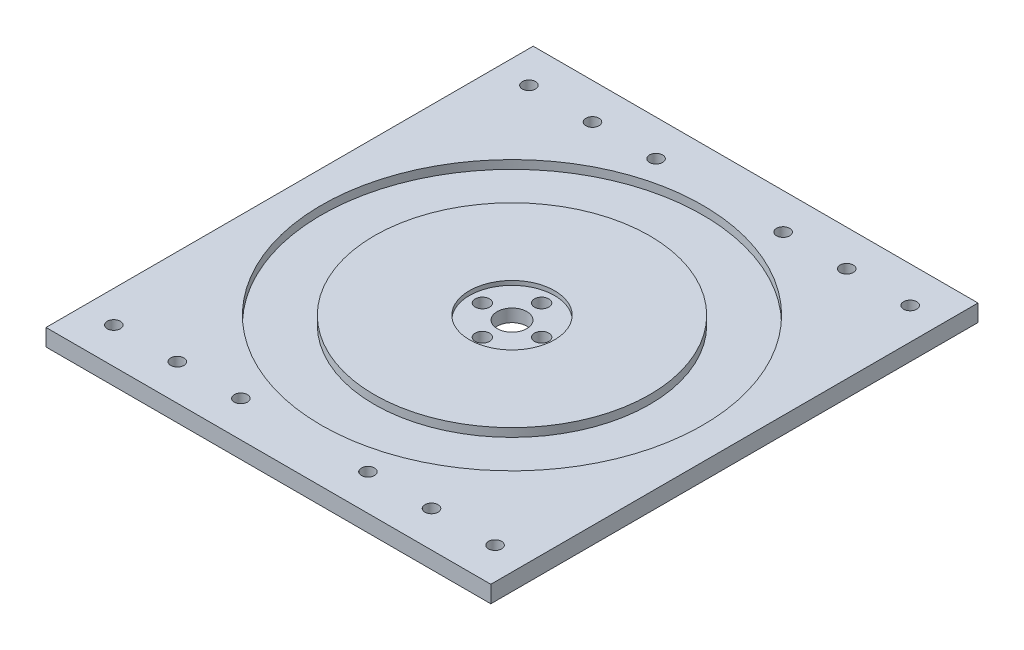
ISO-10303-21;
HEADER;
FILE_DESCRIPTION(('STEP AP214'),'2;1');
FILE_NAME('part.step','',(''),(''),'','','');
FILE_SCHEMA(('AUTOMOTIVE_DESIGN { 1 0 10303 214 1 1 1 1 }'));
ENDSEC;
DATA;
#1=APPLICATION_CONTEXT('core data for automotive mechanical design processes');
#2=APPLICATION_PROTOCOL_DEFINITION('international standard','automotive_design',2000,#1);
#3=PRODUCT_CONTEXT('',#1,'mechanical');
#4=PRODUCT('Part','Part','',(#3));
#5=PRODUCT_RELATED_PRODUCT_CATEGORY('part','',(#4));
#6=PRODUCT_DEFINITION_FORMATION('','',#4);
#7=PRODUCT_DEFINITION_CONTEXT('part definition',#1,'design');
#8=PRODUCT_DEFINITION('design','',#6,#7);
#9=PRODUCT_DEFINITION_SHAPE('','',#8);
#10=(LENGTH_UNIT() NAMED_UNIT(*) SI_UNIT(.MILLI.,.METRE.));
#11=(NAMED_UNIT(*) PLANE_ANGLE_UNIT() SI_UNIT($,.RADIAN.));
#12=(NAMED_UNIT(*) SI_UNIT($,.STERADIAN.) SOLID_ANGLE_UNIT());
#13=UNCERTAINTY_MEASURE_WITH_UNIT(LENGTH_MEASURE(1.E-05),#10,'distance_accuracy_value','');
#14=(GEOMETRIC_REPRESENTATION_CONTEXT(3) GLOBAL_UNCERTAINTY_ASSIGNED_CONTEXT((#13)) GLOBAL_UNIT_ASSIGNED_CONTEXT((#10,
#11,#12)) REPRESENTATION_CONTEXT('',''));
#15=CARTESIAN_POINT('',(0.,0.,0.));
#16=DIRECTION('',(0.,0.,1.));
#17=DIRECTION('',(1.,0.,0.));
#18=AXIS2_PLACEMENT_3D('',#15,#16,#17);
#19=CARTESIAN_POINT('',(0.,4.,0.));
#20=DIRECTION('',(0.,-1.,0.));
#21=DIRECTION('',(0.,0.,-1.));
#22=AXIS2_PLACEMENT_3D('',#19,#20,#21);
#23=CYLINDRICAL_SURFACE('',#22,3.5);
#24=CARTESIAN_POINT('',(0.,0.,0.));
#25=DIRECTION('',(0.,1.,0.));
#26=DIRECTION('',(0.,0.,1.));
#27=AXIS2_PLACEMENT_3D('',#24,#25,#26);
#28=CIRCLE('',#27,3.5);
#29=CARTESIAN_POINT('',(0.,0.,3.5));
#30=VERTEX_POINT('',#29);
#31=EDGE_CURVE('E109',#30,#30,#28,.T.);
#32=ORIENTED_EDGE('',*,*,#31,.F.);
#33=EDGE_LOOP('',(#32));
#34=FACE_BOUND('',#33,.T.);
#35=CARTESIAN_POINT('',(0.,3.,0.));
#36=DIRECTION('',(0.,1.,0.));
#37=DIRECTION('',(0.,0.,1.));
#38=AXIS2_PLACEMENT_3D('',#35,#36,#37);
#39=CIRCLE('',#38,3.5);
#40=CARTESIAN_POINT('',(0.,3.,3.5));
#41=VERTEX_POINT('',#40);
#42=EDGE_CURVE('E43',#41,#41,#39,.T.);
#43=ORIENTED_EDGE('',*,*,#42,.T.);
#44=EDGE_LOOP('',(#43));
#45=FACE_BOUND('',#44,.T.);
#46=ADVANCED_FACE('F39',(#34,#45),#23,.F.);
#47=CARTESIAN_POINT('',(0.,4.,0.));
#48=DIRECTION('',(0.,-1.,0.));
#49=DIRECTION('',(0.,0.,-1.));
#50=AXIS2_PLACEMENT_3D('',#47,#48,#49);
#51=PLANE('',#50);
#52=CARTESIAN_POINT('',(0.,4.,0.));
#53=DIRECTION('',(0.,1.,0.));
#54=DIRECTION('',(0.,0.,1.));
#55=AXIS2_PLACEMENT_3D('',#52,#53,#54);
#56=CIRCLE('',#55,10.05);
#57=CARTESIAN_POINT('',(0.,4.,10.05));
#58=VERTEX_POINT('',#57);
#59=EDGE_CURVE('E207',#58,#58,#56,.T.);
#60=ORIENTED_EDGE('',*,*,#59,.F.);
#61=EDGE_LOOP('',(#60));
#62=FACE_BOUND('',#61,.T.);
#63=CARTESIAN_POINT('',(0.,4.,0.));
#64=DIRECTION('',(0.,1.,0.));
#65=DIRECTION('',(0.,0.,1.));
#66=AXIS2_PLACEMENT_3D('',#63,#64,#65);
#67=CIRCLE('',#66,32.5);
#68=CARTESIAN_POINT('',(0.,4.,32.5));
#69=VERTEX_POINT('',#68);
#70=EDGE_CURVE('E202',#69,#69,#67,.T.);
#71=ORIENTED_EDGE('',*,*,#70,.T.);
#72=EDGE_LOOP('',(#71));
#73=FACE_BOUND('',#72,.T.);
#74=ADVANCED_FACE('F258',(#62,#73),#51,.F.);
#75=CARTESIAN_POINT('',(0.,4.,0.));
#76=DIRECTION('',(0.,1.,0.));
#77=DIRECTION('',(0.,0.,1.));
#78=AXIS2_PLACEMENT_3D('',#75,#76,#77);
#79=CIRCLE('',#78,45.);
#80=CARTESIAN_POINT('',(0.,4.,45.));
#81=VERTEX_POINT('',#80);
#82=EDGE_CURVE('E196',#81,#81,#79,.T.);
#83=ORIENTED_EDGE('',*,*,#82,.F.);
#84=EDGE_LOOP('',(#83));
#85=FACE_BOUND('',#84,.T.);
#86=DIRECTION('',(0.,0.,-1.));
#87=VECTOR('',#86,1.);
#88=CARTESIAN_POINT('',(52.5,4.,57.5));
#89=LINE('',#88,#87);
#90=CARTESIAN_POINT('',(52.5,4.,57.5));
#91=VERTEX_POINT('',#90);
#92=CARTESIAN_POINT('',(52.5,4.,-57.5));
#93=VERTEX_POINT('',#92);
#94=EDGE_CURVE('E93',#91,#93,#89,.T.);
#95=ORIENTED_EDGE('',*,*,#94,.T.);
#96=DIRECTION('',(-1.,0.,0.));
#97=VECTOR('',#96,1.);
#98=CARTESIAN_POINT('',(-52.5,4.,-57.5));
#99=LINE('',#98,#97);
#100=CARTESIAN_POINT('',(-52.5,4.,-57.5));
#101=VERTEX_POINT('',#100);
#102=EDGE_CURVE('E87',#93,#101,#99,.T.);
#103=ORIENTED_EDGE('',*,*,#102,.T.);
#104=DIRECTION('',(0.,0.,1.));
#105=VECTOR('',#104,1.);
#106=CARTESIAN_POINT('',(-52.5,4.,57.5));
#107=LINE('',#106,#105);
#108=CARTESIAN_POINT('',(-52.5,4.,57.5));
#109=VERTEX_POINT('',#108);
#110=EDGE_CURVE('E91',#101,#109,#107,.T.);
#111=ORIENTED_EDGE('',*,*,#110,.T.);
#112=DIRECTION('',(1.,0.,0.));
#113=VECTOR('',#112,1.);
#114=CARTESIAN_POINT('',(-52.5,4.,57.5));
#115=LINE('',#114,#113);
#116=EDGE_CURVE('E57',#109,#91,#115,.T.);
#117=ORIENTED_EDGE('',*,*,#116,.T.);
#118=EDGE_LOOP('',(#95,#103,#111,#117));
#119=FACE_BOUND('',#118,.T.);
#120=CARTESIAN_POINT('',(45.,4.,-49.));
#121=DIRECTION('',(0.,1.,0.));
#122=DIRECTION('',(0.,0.,1.));
#123=AXIS2_PLACEMENT_3D('',#120,#121,#122);
#124=CIRCLE('',#123,1.55);
#125=CARTESIAN_POINT('',(45.,4.,-47.45));
#126=VERTEX_POINT('',#125);
#127=EDGE_CURVE('E123',#126,#126,#124,.T.);
#128=ORIENTED_EDGE('',*,*,#127,.F.);
#129=EDGE_LOOP('',(#128));
#130=FACE_BOUND('',#129,.T.);
#131=CARTESIAN_POINT('',(45.,4.,49.));
#132=DIRECTION('',(0.,1.,0.));
#133=DIRECTION('',(0.,0.,-1.));
#134=AXIS2_PLACEMENT_3D('',#131,#132,#133);
#135=CIRCLE('',#134,1.55);
#136=CARTESIAN_POINT('',(45.,4.,47.45));
#137=VERTEX_POINT('',#136);
#138=EDGE_CURVE('E127',#137,#137,#135,.T.);
#139=ORIENTED_EDGE('',*,*,#138,.F.);
#140=EDGE_LOOP('',(#139));
#141=FACE_BOUND('',#140,.T.);
#142=CARTESIAN_POINT('',(-45.,4.,49.));
#143=DIRECTION('',(0.,1.,0.));
#144=DIRECTION('',(0.,0.,1.));
#145=AXIS2_PLACEMENT_3D('',#142,#143,#144);
#146=CIRCLE('',#145,1.55);
#147=CARTESIAN_POINT('',(-45.,4.,50.55));
#148=VERTEX_POINT('',#147);
#149=EDGE_CURVE('E133',#148,#148,#146,.T.);
#150=ORIENTED_EDGE('',*,*,#149,.F.);
#151=EDGE_LOOP('',(#150));
#152=FACE_BOUND('',#151,.T.);
#153=CARTESIAN_POINT('',(-45.,4.,-49.));
#154=DIRECTION('',(0.,1.,0.));
#155=DIRECTION('',(0.,0.,-1.));
#156=AXIS2_PLACEMENT_3D('',#153,#154,#155);
#157=CIRCLE('',#156,1.55);
#158=CARTESIAN_POINT('',(-45.,4.,-50.55));
#159=VERTEX_POINT('',#158);
#160=EDGE_CURVE('E139',#159,#159,#157,.T.);
#161=ORIENTED_EDGE('',*,*,#160,.F.);
#162=EDGE_LOOP('',(#161));
#163=FACE_BOUND('',#162,.T.);
#164=CARTESIAN_POINT('',(-15.,4.,49.));
#165=DIRECTION('',(0.,1.,0.));
#166=DIRECTION('',(0.,0.,1.));
#167=AXIS2_PLACEMENT_3D('',#164,#165,#166);
#168=CIRCLE('',#167,1.55);
#169=CARTESIAN_POINT('',(-15.,4.,50.55));
#170=VERTEX_POINT('',#169);
#171=EDGE_CURVE('E145',#170,#170,#168,.T.);
#172=ORIENTED_EDGE('',*,*,#171,.F.);
#173=EDGE_LOOP('',(#172));
#174=FACE_BOUND('',#173,.T.);
#175=CARTESIAN_POINT('',(15.,4.,49.));
#176=DIRECTION('',(0.,1.,0.));
#177=DIRECTION('',(0.,0.,-1.));
#178=AXIS2_PLACEMENT_3D('',#175,#176,#177);
#179=CIRCLE('',#178,1.55);
#180=CARTESIAN_POINT('',(15.,4.,47.45));
#181=VERTEX_POINT('',#180);
#182=EDGE_CURVE('E151',#181,#181,#179,.T.);
#183=ORIENTED_EDGE('',*,*,#182,.F.);
#184=EDGE_LOOP('',(#183));
#185=FACE_BOUND('',#184,.T.);
#186=CARTESIAN_POINT('',(15.,4.,-49.));
#187=DIRECTION('',(0.,1.,0.));
#188=DIRECTION('',(0.,0.,1.));
#189=AXIS2_PLACEMENT_3D('',#186,#187,#188);
#190=CIRCLE('',#189,1.55);
#191=CARTESIAN_POINT('',(15.,4.,-47.45));
#192=VERTEX_POINT('',#191);
#193=EDGE_CURVE('E157',#192,#192,#190,.T.);
#194=ORIENTED_EDGE('',*,*,#193,.F.);
#195=EDGE_LOOP('',(#194));
#196=FACE_BOUND('',#195,.T.);
#197=CARTESIAN_POINT('',(-15.,4.,-49.));
#198=DIRECTION('',(0.,1.,0.));
#199=DIRECTION('',(0.,0.,-1.));
#200=AXIS2_PLACEMENT_3D('',#197,#198,#199);
#201=CIRCLE('',#200,1.55);
#202=CARTESIAN_POINT('',(-15.,4.,-50.55));
#203=VERTEX_POINT('',#202);
#204=EDGE_CURVE('E163',#203,#203,#201,.T.);
#205=ORIENTED_EDGE('',*,*,#204,.F.);
#206=EDGE_LOOP('',(#205));
#207=FACE_BOUND('',#206,.T.);
#208=CARTESIAN_POINT('',(30.0000000000001,4.,-49.000000000001));
#209=DIRECTION('',(0.,1.,0.));
#210=DIRECTION('',(0.,0.,1.));
#211=AXIS2_PLACEMENT_3D('',#208,#209,#210);
#212=CIRCLE('',#211,1.55);
#213=CARTESIAN_POINT('',(30.0000000000001,4.,-47.450000000001));
#214=VERTEX_POINT('',#213);
#215=EDGE_CURVE('E169',#214,#214,#212,.T.);
#216=ORIENTED_EDGE('',*,*,#215,.F.);
#217=EDGE_LOOP('',(#216));
#218=FACE_BOUND('',#217,.T.);
#219=CARTESIAN_POINT('',(-29.9999999999999,4.,-49.000000000001));
#220=DIRECTION('',(0.,1.,0.));
#221=DIRECTION('',(0.,0.,1.));
#222=AXIS2_PLACEMENT_3D('',#219,#220,#221);
#223=CIRCLE('',#222,1.55);
#224=CARTESIAN_POINT('',(-29.9999999999999,4.,-47.450000000001));
#225=VERTEX_POINT('',#224);
#226=EDGE_CURVE('E175',#225,#225,#223,.T.);
#227=ORIENTED_EDGE('',*,*,#226,.F.);
#228=EDGE_LOOP('',(#227));
#229=FACE_BOUND('',#228,.T.);
#230=CARTESIAN_POINT('',(-30.,4.,48.999999999999));
#231=DIRECTION('',(0.,1.,0.));
#232=DIRECTION('',(0.,0.,1.));
#233=AXIS2_PLACEMENT_3D('',#230,#231,#232);
#234=CIRCLE('',#233,1.55000000000001);
#235=CARTESIAN_POINT('',(-30.,4.,50.549999999999));
#236=VERTEX_POINT('',#235);
#237=EDGE_CURVE('E181',#236,#236,#234,.T.);
#238=ORIENTED_EDGE('',*,*,#237,.F.);
#239=EDGE_LOOP('',(#238));
#240=FACE_BOUND('',#239,.T.);
#241=CARTESIAN_POINT('',(30.,4.,48.9999999999991));
#242=DIRECTION('',(0.,1.,0.));
#243=DIRECTION('',(0.,0.,1.));
#244=AXIS2_PLACEMENT_3D('',#241,#242,#243);
#245=CIRCLE('',#244,1.55);
#246=CARTESIAN_POINT('',(30.,4.,50.5499999999991));
#247=VERTEX_POINT('',#246);
#248=EDGE_CURVE('E187',#247,#247,#245,.T.);
#249=ORIENTED_EDGE('',*,*,#248,.F.);
#250=EDGE_LOOP('',(#249));
#251=FACE_BOUND('',#250,.T.);
#252=ADVANCED_FACE('F88',(#85,#119,#130,#141,#152,#163,#174,#185,#196,#207,#218,#229,#240,#251),
#51,.F.);
#253=CARTESIAN_POINT('',(0.,0.,0.));
#254=DIRECTION('',(0.,-1.,0.));
#255=DIRECTION('',(0.,0.,-1.));
#256=AXIS2_PLACEMENT_3D('',#253,#254,#255);
#257=PLANE('',#256);
#258=CARTESIAN_POINT('',(7.0000000000002,0.,-1.97666086873723E-13));
#259=DIRECTION('',(0.,-1.,0.));
#260=DIRECTION('',(0.,0.,-1.));
#261=AXIS2_PLACEMENT_3D('',#258,#259,#260);
#262=CIRCLE('',#261,1.70000000000015);
#263=CARTESIAN_POINT('',(7.0000000000002,0.,-1.70000000000035));
#264=VERTEX_POINT('',#263);
#265=EDGE_CURVE('E225',#264,#264,#262,.F.);
#266=ORIENTED_EDGE('',*,*,#265,.T.);
#267=EDGE_LOOP('',(#266));
#268=FACE_BOUND('',#267,.T.);
#269=CARTESIAN_POINT('',(0.,0.,-7.));
#270=DIRECTION('',(0.,-1.,0.));
#271=DIRECTION('',(0.,0.,-1.));
#272=AXIS2_PLACEMENT_3D('',#269,#270,#271);
#273=CIRCLE('',#272,1.7);
#274=CARTESIAN_POINT('',(0.,0.,-8.7));
#275=VERTEX_POINT('',#274);
#276=EDGE_CURVE('E231',#275,#275,#273,.F.);
#277=ORIENTED_EDGE('',*,*,#276,.T.);
#278=EDGE_LOOP('',(#277));
#279=FACE_BOUND('',#278,.T.);
#280=CARTESIAN_POINT('',(3.95332173747447E-13,0.,7.));
#281=DIRECTION('',(0.,-1.,0.));
#282=DIRECTION('',(0.,0.,-1.));
#283=AXIS2_PLACEMENT_3D('',#280,#281,#282);
#284=CIRCLE('',#283,1.70000000000042);
#285=CARTESIAN_POINT('',(3.95332173747447E-13,0.,5.29999999999958));
#286=VERTEX_POINT('',#285);
#287=EDGE_CURVE('E219',#286,#286,#284,.F.);
#288=ORIENTED_EDGE('',*,*,#287,.T.);
#289=EDGE_LOOP('',(#288));
#290=FACE_BOUND('',#289,.T.);
#291=CARTESIAN_POINT('',(-6.9999999999998,0.,1.98523339633126E-13));
#292=DIRECTION('',(0.,-1.,0.));
#293=DIRECTION('',(0.,0.,-1.));
#294=AXIS2_PLACEMENT_3D('',#291,#292,#293);
#295=CIRCLE('',#294,1.70000000000032);
#296=CARTESIAN_POINT('',(-6.9999999999998,0.,-1.70000000000012));
#297=VERTEX_POINT('',#296);
#298=EDGE_CURVE('E211',#297,#297,#295,.F.);
#299=ORIENTED_EDGE('',*,*,#298,.T.);
#300=EDGE_LOOP('',(#299));
#301=FACE_BOUND('',#300,.T.);
#302=CARTESIAN_POINT('',(-30.,0.,48.999999999999));
#303=DIRECTION('',(0.,1.,0.));
#304=DIRECTION('',(0.,0.,1.));
#305=AXIS2_PLACEMENT_3D('',#302,#303,#304);
#306=CIRCLE('',#305,1.55000000000001);
#307=CARTESIAN_POINT('',(-30.,0.,50.549999999999));
#308=VERTEX_POINT('',#307);
#309=EDGE_CURVE('E184',#308,#308,#306,.T.);
#310=ORIENTED_EDGE('',*,*,#309,.T.);
#311=EDGE_LOOP('',(#310));
#312=FACE_BOUND('',#311,.T.);
#313=CARTESIAN_POINT('',(30.0000000000001,0.,-49.000000000001));
#314=DIRECTION('',(0.,1.,0.));
#315=DIRECTION('',(0.,0.,1.));
#316=AXIS2_PLACEMENT_3D('',#313,#314,#315);
#317=CIRCLE('',#316,1.55);
#318=CARTESIAN_POINT('',(30.0000000000001,0.,-47.450000000001));
#319=VERTEX_POINT('',#318);
#320=EDGE_CURVE('E172',#319,#319,#317,.T.);
#321=ORIENTED_EDGE('',*,*,#320,.T.);
#322=EDGE_LOOP('',(#321));
#323=FACE_BOUND('',#322,.T.);
#324=CARTESIAN_POINT('',(15.,0.,-49.));
#325=DIRECTION('',(0.,1.,0.));
#326=DIRECTION('',(0.,0.,1.));
#327=AXIS2_PLACEMENT_3D('',#324,#325,#326);
#328=CIRCLE('',#327,1.55);
#329=CARTESIAN_POINT('',(15.,0.,-47.45));
#330=VERTEX_POINT('',#329);
#331=EDGE_CURVE('E160',#330,#330,#328,.T.);
#332=ORIENTED_EDGE('',*,*,#331,.T.);
#333=EDGE_LOOP('',(#332));
#334=FACE_BOUND('',#333,.T.);
#335=CARTESIAN_POINT('',(-15.,0.,49.));
#336=DIRECTION('',(0.,1.,0.));
#337=DIRECTION('',(0.,0.,1.));
#338=AXIS2_PLACEMENT_3D('',#335,#336,#337);
#339=CIRCLE('',#338,1.55);
#340=CARTESIAN_POINT('',(-15.,0.,50.55));
#341=VERTEX_POINT('',#340);
#342=EDGE_CURVE('E148',#341,#341,#339,.T.);
#343=ORIENTED_EDGE('',*,*,#342,.T.);
#344=EDGE_LOOP('',(#343));
#345=FACE_BOUND('',#344,.T.);
#346=CARTESIAN_POINT('',(-45.,0.,49.));
#347=DIRECTION('',(0.,1.,0.));
#348=DIRECTION('',(0.,0.,1.));
#349=AXIS2_PLACEMENT_3D('',#346,#347,#348);
#350=CIRCLE('',#349,1.55);
#351=CARTESIAN_POINT('',(-45.,0.,50.55));
#352=VERTEX_POINT('',#351);
#353=EDGE_CURVE('E136',#352,#352,#350,.T.);
#354=ORIENTED_EDGE('',*,*,#353,.T.);
#355=EDGE_LOOP('',(#354));
#356=FACE_BOUND('',#355,.T.);
#357=CARTESIAN_POINT('',(45.,0.,-49.));
#358=DIRECTION('',(0.,1.,0.));
#359=DIRECTION('',(0.,0.,1.));
#360=AXIS2_PLACEMENT_3D('',#357,#358,#359);
#361=CIRCLE('',#360,1.55);
#362=CARTESIAN_POINT('',(45.,0.,-47.45));
#363=VERTEX_POINT('',#362);
#364=EDGE_CURVE('E124',#363,#363,#361,.T.);
#365=ORIENTED_EDGE('',*,*,#364,.T.);
#366=EDGE_LOOP('',(#365));
#367=FACE_BOUND('',#366,.T.);
#368=DIRECTION('',(0.,0.,-1.));
#369=VECTOR('',#368,1.);
#370=CARTESIAN_POINT('',(52.5,0.,57.5));
#371=LINE('',#370,#369);
#372=CARTESIAN_POINT('',(52.5,0.,57.5));
#373=VERTEX_POINT('',#372);
#374=CARTESIAN_POINT('',(52.5,0.,-57.5));
#375=VERTEX_POINT('',#374);
#376=EDGE_CURVE('E106',#373,#375,#371,.T.);
#377=ORIENTED_EDGE('',*,*,#376,.F.);
#378=DIRECTION('',(1.,0.,0.));
#379=VECTOR('',#378,1.);
#380=CARTESIAN_POINT('',(-52.5,0.,57.5));
#381=LINE('',#380,#379);
#382=CARTESIAN_POINT('',(-52.5,0.,57.5));
#383=VERTEX_POINT('',#382);
#384=EDGE_CURVE('E80',#383,#373,#381,.T.);
#385=ORIENTED_EDGE('',*,*,#384,.F.);
#386=DIRECTION('',(0.,0.,1.));
#387=VECTOR('',#386,1.);
#388=CARTESIAN_POINT('',(-52.5,0.,57.5));
#389=LINE('',#388,#387);
#390=CARTESIAN_POINT('',(-52.5,0.,-57.5));
#391=VERTEX_POINT('',#390);
#392=EDGE_CURVE('E74',#391,#383,#389,.T.);
#393=ORIENTED_EDGE('',*,*,#392,.F.);
#394=DIRECTION('',(-1.,0.,0.));
#395=VECTOR('',#394,1.);
#396=CARTESIAN_POINT('',(-52.5,0.,-57.5));
#397=LINE('',#396,#395);
#398=EDGE_CURVE('E97',#375,#391,#397,.T.);
#399=ORIENTED_EDGE('',*,*,#398,.F.);
#400=EDGE_LOOP('',(#377,#385,#393,#399));
#401=FACE_BOUND('',#400,.T.);
#402=ORIENTED_EDGE('',*,*,#31,.T.);
#403=EDGE_LOOP('',(#402));
#404=FACE_BOUND('',#403,.T.);
#405=CARTESIAN_POINT('',(45.,0.,49.));
#406=DIRECTION('',(0.,1.,0.));
#407=DIRECTION('',(0.,0.,-1.));
#408=AXIS2_PLACEMENT_3D('',#405,#406,#407);
#409=CIRCLE('',#408,1.55);
#410=CARTESIAN_POINT('',(45.,0.,47.45));
#411=VERTEX_POINT('',#410);
#412=EDGE_CURVE('E130',#411,#411,#409,.T.);
#413=ORIENTED_EDGE('',*,*,#412,.T.);
#414=EDGE_LOOP('',(#413));
#415=FACE_BOUND('',#414,.T.);
#416=CARTESIAN_POINT('',(-45.,0.,-49.));
#417=DIRECTION('',(0.,1.,0.));
#418=DIRECTION('',(0.,0.,-1.));
#419=AXIS2_PLACEMENT_3D('',#416,#417,#418);
#420=CIRCLE('',#419,1.55);
#421=CARTESIAN_POINT('',(-45.,0.,-50.55));
#422=VERTEX_POINT('',#421);
#423=EDGE_CURVE('E142',#422,#422,#420,.T.);
#424=ORIENTED_EDGE('',*,*,#423,.T.);
#425=EDGE_LOOP('',(#424));
#426=FACE_BOUND('',#425,.T.);
#427=CARTESIAN_POINT('',(15.,0.,49.));
#428=DIRECTION('',(0.,1.,0.));
#429=DIRECTION('',(0.,0.,-1.));
#430=AXIS2_PLACEMENT_3D('',#427,#428,#429);
#431=CIRCLE('',#430,1.55);
#432=CARTESIAN_POINT('',(15.,0.,47.45));
#433=VERTEX_POINT('',#432);
#434=EDGE_CURVE('E154',#433,#433,#431,.T.);
#435=ORIENTED_EDGE('',*,*,#434,.T.);
#436=EDGE_LOOP('',(#435));
#437=FACE_BOUND('',#436,.T.);
#438=CARTESIAN_POINT('',(-15.,0.,-49.));
#439=DIRECTION('',(0.,1.,0.));
#440=DIRECTION('',(0.,0.,-1.));
#441=AXIS2_PLACEMENT_3D('',#438,#439,#440);
#442=CIRCLE('',#441,1.55);
#443=CARTESIAN_POINT('',(-15.,0.,-50.55));
#444=VERTEX_POINT('',#443);
#445=EDGE_CURVE('E166',#444,#444,#442,.T.);
#446=ORIENTED_EDGE('',*,*,#445,.T.);
#447=EDGE_LOOP('',(#446));
#448=FACE_BOUND('',#447,.T.);
#449=CARTESIAN_POINT('',(-29.9999999999999,0.,-49.000000000001));
#450=DIRECTION('',(0.,1.,0.));
#451=DIRECTION('',(0.,0.,1.));
#452=AXIS2_PLACEMENT_3D('',#449,#450,#451);
#453=CIRCLE('',#452,1.55);
#454=CARTESIAN_POINT('',(-29.9999999999999,0.,-47.450000000001));
#455=VERTEX_POINT('',#454);
#456=EDGE_CURVE('E178',#455,#455,#453,.T.);
#457=ORIENTED_EDGE('',*,*,#456,.T.);
#458=EDGE_LOOP('',(#457));
#459=FACE_BOUND('',#458,.T.);
#460=CARTESIAN_POINT('',(30.,0.,48.9999999999991));
#461=DIRECTION('',(0.,1.,0.));
#462=DIRECTION('',(0.,0.,1.));
#463=AXIS2_PLACEMENT_3D('',#460,#461,#462);
#464=CIRCLE('',#463,1.55);
#465=CARTESIAN_POINT('',(30.,0.,50.5499999999991));
#466=VERTEX_POINT('',#465);
#467=EDGE_CURVE('E190',#466,#466,#464,.T.);
#468=ORIENTED_EDGE('',*,*,#467,.T.);
#469=EDGE_LOOP('',(#468));
#470=FACE_BOUND('',#469,.T.);
#471=ADVANCED_FACE('F117',(#268,#279,#290,#301,#312,#323,#334,#345,#356,#367,#401,#404,#415,
#426,#437,#448,#459,#470),#257,.T.);
#472=CARTESIAN_POINT('',(52.5,4.,57.5));
#473=DIRECTION('',(-1.,0.,0.));
#474=DIRECTION('',(0.,0.,1.));
#475=AXIS2_PLACEMENT_3D('',#472,#473,#474);
#476=PLANE('',#475);
#477=ORIENTED_EDGE('',*,*,#376,.T.);
#478=DIRECTION('',(0.,-1.,0.));
#479=VECTOR('',#478,1.);
#480=CARTESIAN_POINT('',(52.5,4.,-57.5));
#481=LINE('',#480,#479);
#482=EDGE_CURVE('E11',#93,#375,#481,.T.);
#483=ORIENTED_EDGE('',*,*,#482,.F.);
#484=ORIENTED_EDGE('',*,*,#94,.F.);
#485=DIRECTION('',(0.,-1.,0.));
#486=VECTOR('',#485,1.);
#487=CARTESIAN_POINT('',(52.5,4.,57.5));
#488=LINE('',#487,#486);
#489=EDGE_CURVE('E102',#91,#373,#488,.T.);
#490=ORIENTED_EDGE('',*,*,#489,.T.);
#491=EDGE_LOOP('',(#477,#483,#484,#490));
#492=FACE_BOUND('',#491,.T.);
#493=ADVANCED_FACE('F41',(#492),#476,.F.);
#494=CARTESIAN_POINT('',(-52.5,4.,-57.5));
#495=DIRECTION('',(0.,0.,1.));
#496=DIRECTION('',(1.,0.,0.));
#497=AXIS2_PLACEMENT_3D('',#494,#495,#496);
#498=PLANE('',#497);
#499=ORIENTED_EDGE('',*,*,#398,.T.);
#500=DIRECTION('',(0.,-1.,0.));
#501=VECTOR('',#500,1.);
#502=CARTESIAN_POINT('',(-52.5,4.,-57.5));
#503=LINE('',#502,#501);
#504=EDGE_CURVE('E49',#101,#391,#503,.T.);
#505=ORIENTED_EDGE('',*,*,#504,.F.);
#506=ORIENTED_EDGE('',*,*,#102,.F.);
#507=ORIENTED_EDGE('',*,*,#482,.T.);
#508=EDGE_LOOP('',(#499,#505,#506,#507));
#509=FACE_BOUND('',#508,.T.);
#510=ADVANCED_FACE('F96',(#509),#498,.F.);
#511=CARTESIAN_POINT('',(-52.5,4.,57.5));
#512=DIRECTION('',(1.,0.,0.));
#513=DIRECTION('',(0.,0.,-1.));
#514=AXIS2_PLACEMENT_3D('',#511,#512,#513);
#515=PLANE('',#514);
#516=ORIENTED_EDGE('',*,*,#392,.T.);
#517=DIRECTION('',(0.,-1.,0.));
#518=VECTOR('',#517,1.);
#519=CARTESIAN_POINT('',(-52.5,4.,57.5));
#520=LINE('',#519,#518);
#521=EDGE_CURVE('E98',#109,#383,#520,.T.);
#522=ORIENTED_EDGE('',*,*,#521,.F.);
#523=ORIENTED_EDGE('',*,*,#110,.F.);
#524=ORIENTED_EDGE('',*,*,#504,.T.);
#525=EDGE_LOOP('',(#516,#522,#523,#524));
#526=FACE_BOUND('',#525,.T.);
#527=ADVANCED_FACE('F100',(#526),#515,.F.);
#528=CARTESIAN_POINT('',(-52.5,4.,57.5));
#529=DIRECTION('',(0.,0.,-1.));
#530=DIRECTION('',(-1.,0.,0.));
#531=AXIS2_PLACEMENT_3D('',#528,#529,#530);
#532=PLANE('',#531);
#533=ORIENTED_EDGE('',*,*,#384,.T.);
#534=ORIENTED_EDGE('',*,*,#489,.F.);
#535=ORIENTED_EDGE('',*,*,#116,.F.);
#536=ORIENTED_EDGE('',*,*,#521,.T.);
#537=EDGE_LOOP('',(#533,#534,#535,#536));
#538=FACE_BOUND('',#537,.T.);
#539=ADVANCED_FACE('F114',(#538),#532,.F.);
#540=CARTESIAN_POINT('',(45.,4.,-49.));
#541=DIRECTION('',(0.,-1.,0.));
#542=DIRECTION('',(0.,0.,-1.));
#543=AXIS2_PLACEMENT_3D('',#540,#541,#542);
#544=CYLINDRICAL_SURFACE('',#543,1.55);
#545=ORIENTED_EDGE('',*,*,#127,.T.);
#546=EDGE_LOOP('',(#545));
#547=FACE_BOUND('',#546,.T.);
#548=ORIENTED_EDGE('',*,*,#364,.F.);
#549=EDGE_LOOP('',(#548));
#550=FACE_BOUND('',#549,.T.);
#551=ADVANCED_FACE('F269',(#547,#550),#544,.F.);
#552=CARTESIAN_POINT('',(45.,4.,49.));
#553=DIRECTION('',(0.,-1.,0.));
#554=DIRECTION('',(0.,0.,-1.));
#555=AXIS2_PLACEMENT_3D('',#552,#553,#554);
#556=CYLINDRICAL_SURFACE('',#555,1.55);
#557=ORIENTED_EDGE('',*,*,#138,.T.);
#558=EDGE_LOOP('',(#557));
#559=FACE_BOUND('',#558,.T.);
#560=ORIENTED_EDGE('',*,*,#412,.F.);
#561=EDGE_LOOP('',(#560));
#562=FACE_BOUND('',#561,.T.);
#563=ADVANCED_FACE('F504',(#559,#562),#556,.F.);
#564=CARTESIAN_POINT('',(-45.,4.,49.));
#565=DIRECTION('',(0.,-1.,0.));
#566=DIRECTION('',(0.,0.,-1.));
#567=AXIS2_PLACEMENT_3D('',#564,#565,#566);
#568=CYLINDRICAL_SURFACE('',#567,1.55);
#569=ORIENTED_EDGE('',*,*,#149,.T.);
#570=EDGE_LOOP('',(#569));
#571=FACE_BOUND('',#570,.T.);
#572=ORIENTED_EDGE('',*,*,#353,.F.);
#573=EDGE_LOOP('',(#572));
#574=FACE_BOUND('',#573,.T.);
#575=ADVANCED_FACE('F493',(#571,#574),#568,.F.);
#576=CARTESIAN_POINT('',(-45.,4.,-49.));
#577=DIRECTION('',(0.,-1.,0.));
#578=DIRECTION('',(0.,0.,-1.));
#579=AXIS2_PLACEMENT_3D('',#576,#577,#578);
#580=CYLINDRICAL_SURFACE('',#579,1.55);
#581=ORIENTED_EDGE('',*,*,#160,.T.);
#582=EDGE_LOOP('',(#581));
#583=FACE_BOUND('',#582,.T.);
#584=ORIENTED_EDGE('',*,*,#423,.F.);
#585=EDGE_LOOP('',(#584));
#586=FACE_BOUND('',#585,.T.);
#587=ADVANCED_FACE('F482',(#583,#586),#580,.F.);
#588=CARTESIAN_POINT('',(-15.,4.,49.));
#589=DIRECTION('',(0.,-1.,0.));
#590=DIRECTION('',(0.,0.,-1.));
#591=AXIS2_PLACEMENT_3D('',#588,#589,#590);
#592=CYLINDRICAL_SURFACE('',#591,1.55);
#593=ORIENTED_EDGE('',*,*,#171,.T.);
#594=EDGE_LOOP('',(#593));
#595=FACE_BOUND('',#594,.T.);
#596=ORIENTED_EDGE('',*,*,#342,.F.);
#597=EDGE_LOOP('',(#596));
#598=FACE_BOUND('',#597,.T.);
#599=ADVANCED_FACE('F471',(#595,#598),#592,.F.);
#600=CARTESIAN_POINT('',(15.,4.,49.));
#601=DIRECTION('',(0.,-1.,0.));
#602=DIRECTION('',(0.,0.,-1.));
#603=AXIS2_PLACEMENT_3D('',#600,#601,#602);
#604=CYLINDRICAL_SURFACE('',#603,1.55);
#605=ORIENTED_EDGE('',*,*,#182,.T.);
#606=EDGE_LOOP('',(#605));
#607=FACE_BOUND('',#606,.T.);
#608=ORIENTED_EDGE('',*,*,#434,.F.);
#609=EDGE_LOOP('',(#608));
#610=FACE_BOUND('',#609,.T.);
#611=ADVANCED_FACE('F460',(#607,#610),#604,.F.);
#612=CARTESIAN_POINT('',(15.,4.,-49.));
#613=DIRECTION('',(0.,-1.,0.));
#614=DIRECTION('',(0.,0.,-1.));
#615=AXIS2_PLACEMENT_3D('',#612,#613,#614);
#616=CYLINDRICAL_SURFACE('',#615,1.55);
#617=ORIENTED_EDGE('',*,*,#193,.T.);
#618=EDGE_LOOP('',(#617));
#619=FACE_BOUND('',#618,.T.);
#620=ORIENTED_EDGE('',*,*,#331,.F.);
#621=EDGE_LOOP('',(#620));
#622=FACE_BOUND('',#621,.T.);
#623=ADVANCED_FACE('F449',(#619,#622),#616,.F.);
#624=CARTESIAN_POINT('',(-15.,4.,-49.));
#625=DIRECTION('',(0.,-1.,0.));
#626=DIRECTION('',(0.,0.,-1.));
#627=AXIS2_PLACEMENT_3D('',#624,#625,#626);
#628=CYLINDRICAL_SURFACE('',#627,1.55);
#629=ORIENTED_EDGE('',*,*,#204,.T.);
#630=EDGE_LOOP('',(#629));
#631=FACE_BOUND('',#630,.T.);
#632=ORIENTED_EDGE('',*,*,#445,.F.);
#633=EDGE_LOOP('',(#632));
#634=FACE_BOUND('',#633,.T.);
#635=ADVANCED_FACE('F438',(#631,#634),#628,.F.);
#636=CARTESIAN_POINT('',(30.0000000000001,4.,-49.000000000001));
#637=DIRECTION('',(0.,-1.,0.));
#638=DIRECTION('',(0.,0.,-1.));
#639=AXIS2_PLACEMENT_3D('',#636,#637,#638);
#640=CYLINDRICAL_SURFACE('',#639,1.55);
#641=ORIENTED_EDGE('',*,*,#215,.T.);
#642=EDGE_LOOP('',(#641));
#643=FACE_BOUND('',#642,.T.);
#644=ORIENTED_EDGE('',*,*,#320,.F.);
#645=EDGE_LOOP('',(#644));
#646=FACE_BOUND('',#645,.T.);
#647=ADVANCED_FACE('F427',(#643,#646),#640,.F.);
#648=CARTESIAN_POINT('',(-29.9999999999999,4.,-49.000000000001));
#649=DIRECTION('',(0.,-1.,0.));
#650=DIRECTION('',(0.,0.,-1.));
#651=AXIS2_PLACEMENT_3D('',#648,#649,#650);
#652=CYLINDRICAL_SURFACE('',#651,1.55);
#653=ORIENTED_EDGE('',*,*,#226,.T.);
#654=EDGE_LOOP('',(#653));
#655=FACE_BOUND('',#654,.T.);
#656=ORIENTED_EDGE('',*,*,#456,.F.);
#657=EDGE_LOOP('',(#656));
#658=FACE_BOUND('',#657,.T.);
#659=ADVANCED_FACE('F416',(#655,#658),#652,.F.);
#660=CARTESIAN_POINT('',(-30.,4.,48.999999999999));
#661=DIRECTION('',(0.,-1.,0.));
#662=DIRECTION('',(0.,0.,-1.));
#663=AXIS2_PLACEMENT_3D('',#660,#661,#662);
#664=CYLINDRICAL_SURFACE('',#663,1.55000000000001);
#665=ORIENTED_EDGE('',*,*,#237,.T.);
#666=EDGE_LOOP('',(#665));
#667=FACE_BOUND('',#666,.T.);
#668=ORIENTED_EDGE('',*,*,#309,.F.);
#669=EDGE_LOOP('',(#668));
#670=FACE_BOUND('',#669,.T.);
#671=ADVANCED_FACE('F405',(#667,#670),#664,.F.);
#672=CARTESIAN_POINT('',(30.,4.,48.9999999999991));
#673=DIRECTION('',(0.,-1.,0.));
#674=DIRECTION('',(0.,0.,-1.));
#675=AXIS2_PLACEMENT_3D('',#672,#673,#674);
#676=CYLINDRICAL_SURFACE('',#675,1.55);
#677=ORIENTED_EDGE('',*,*,#248,.T.);
#678=EDGE_LOOP('',(#677));
#679=FACE_BOUND('',#678,.T.);
#680=ORIENTED_EDGE('',*,*,#467,.F.);
#681=EDGE_LOOP('',(#680));
#682=FACE_BOUND('',#681,.T.);
#683=ADVANCED_FACE('F392',(#679,#682),#676,.F.);
#684=CARTESIAN_POINT('',(0.,2.,0.));
#685=DIRECTION('',(0.,1.,0.));
#686=DIRECTION('',(0.,0.,1.));
#687=AXIS2_PLACEMENT_3D('',#684,#685,#686);
#688=CYLINDRICAL_SURFACE('',#687,45.);
#689=CARTESIAN_POINT('',(0.,2.,0.));
#690=DIRECTION('',(0.,1.,0.));
#691=DIRECTION('',(0.,0.,1.));
#692=AXIS2_PLACEMENT_3D('',#689,#690,#691);
#693=CIRCLE('',#692,45.);
#694=CARTESIAN_POINT('',(0.,2.,45.));
#695=VERTEX_POINT('',#694);
#696=EDGE_CURVE('E193',#695,#695,#693,.T.);
#697=ORIENTED_EDGE('',*,*,#696,.F.);
#698=EDGE_LOOP('',(#697));
#699=FACE_BOUND('',#698,.T.);
#700=ORIENTED_EDGE('',*,*,#82,.T.);
#701=EDGE_LOOP('',(#700));
#702=FACE_BOUND('',#701,.T.);
#703=ADVANCED_FACE('F383',(#699,#702),#688,.F.);
#704=CARTESIAN_POINT('',(0.,2.,0.));
#705=DIRECTION('',(0.,1.,0.));
#706=DIRECTION('',(0.,0.,1.));
#707=AXIS2_PLACEMENT_3D('',#704,#705,#706);
#708=PLANE('',#707);
#709=CARTESIAN_POINT('',(0.,2.,0.));
#710=DIRECTION('',(0.,1.,0.));
#711=DIRECTION('',(0.,0.,1.));
#712=AXIS2_PLACEMENT_3D('',#709,#710,#711);
#713=CIRCLE('',#712,32.5);
#714=CARTESIAN_POINT('',(0.,2.,32.5));
#715=VERTEX_POINT('',#714);
#716=EDGE_CURVE('E199',#715,#715,#713,.T.);
#717=ORIENTED_EDGE('',*,*,#716,.F.);
#718=EDGE_LOOP('',(#717));
#719=FACE_BOUND('',#718,.T.);
#720=ORIENTED_EDGE('',*,*,#696,.T.);
#721=EDGE_LOOP('',(#720));
#722=FACE_BOUND('',#721,.T.);
#723=ADVANCED_FACE('F375',(#719,#722),#708,.T.);
#724=CARTESIAN_POINT('',(0.,2.,0.));
#725=DIRECTION('',(0.,1.,0.));
#726=DIRECTION('',(0.,0.,1.));
#727=AXIS2_PLACEMENT_3D('',#724,#725,#726);
#728=CYLINDRICAL_SURFACE('',#727,32.5);
#729=ORIENTED_EDGE('',*,*,#716,.T.);
#730=EDGE_LOOP('',(#729));
#731=FACE_BOUND('',#730,.T.);
#732=ORIENTED_EDGE('',*,*,#70,.F.);
#733=EDGE_LOOP('',(#732));
#734=FACE_BOUND('',#733,.T.);
#735=ADVANCED_FACE('F316',(#731,#734),#728,.T.);
#736=CARTESIAN_POINT('',(0.,3.,0.));
#737=DIRECTION('',(0.,1.,0.));
#738=DIRECTION('',(0.,0.,1.));
#739=AXIS2_PLACEMENT_3D('',#736,#737,#738);
#740=CYLINDRICAL_SURFACE('',#739,10.05);
#741=CARTESIAN_POINT('',(0.,3.,0.));
#742=DIRECTION('',(0.,1.,0.));
#743=DIRECTION('',(0.,0.,1.));
#744=AXIS2_PLACEMENT_3D('',#741,#742,#743);
#745=CIRCLE('',#744,10.05);
#746=CARTESIAN_POINT('',(0.,3.,10.05));
#747=VERTEX_POINT('',#746);
#748=EDGE_CURVE('E210',#747,#747,#745,.T.);
#749=ORIENTED_EDGE('',*,*,#748,.F.);
#750=EDGE_LOOP('',(#749));
#751=FACE_BOUND('',#750,.T.);
#752=ORIENTED_EDGE('',*,*,#59,.T.);
#753=EDGE_LOOP('',(#752));
#754=FACE_BOUND('',#753,.T.);
#755=ADVANCED_FACE('F312',(#751,#754),#740,.F.);
#756=CARTESIAN_POINT('',(0.,3.,0.));
#757=DIRECTION('',(0.,1.,0.));
#758=DIRECTION('',(0.,0.,1.));
#759=AXIS2_PLACEMENT_3D('',#756,#757,#758);
#760=PLANE('',#759);
#761=ORIENTED_EDGE('',*,*,#42,.F.);
#762=EDGE_LOOP('',(#761));
#763=FACE_BOUND('',#762,.T.);
#764=CARTESIAN_POINT('',(-6.9999999999998,3.,1.98523339633126E-13));
#765=DIRECTION('',(0.,1.,0.));
#766=DIRECTION('',(0.,0.,1.));
#767=AXIS2_PLACEMENT_3D('',#764,#765,#766);
#768=CIRCLE('',#767,1.70000000000032);
#769=CARTESIAN_POINT('',(-6.9999999999998,3.,1.70000000000052));
#770=VERTEX_POINT('',#769);
#771=EDGE_CURVE('E216',#770,#770,#768,.F.);
#772=ORIENTED_EDGE('',*,*,#771,.T.);
#773=EDGE_LOOP('',(#772));
#774=FACE_BOUND('',#773,.T.);
#775=CARTESIAN_POINT('',(3.95332173747447E-13,3.,7.));
#776=DIRECTION('',(0.,1.,0.));
#777=DIRECTION('',(0.,0.,1.));
#778=AXIS2_PLACEMENT_3D('',#775,#776,#777);
#779=CIRCLE('',#778,1.70000000000042);
#780=CARTESIAN_POINT('',(3.95332173747447E-13,3.,8.70000000000042));
#781=VERTEX_POINT('',#780);
#782=EDGE_CURVE('E222',#781,#781,#779,.F.);
#783=ORIENTED_EDGE('',*,*,#782,.T.);
#784=EDGE_LOOP('',(#783));
#785=FACE_BOUND('',#784,.T.);
#786=CARTESIAN_POINT('',(7.0000000000002,3.,-1.97666086873723E-13));
#787=DIRECTION('',(0.,1.,0.));
#788=DIRECTION('',(0.,0.,1.));
#789=AXIS2_PLACEMENT_3D('',#786,#787,#788);
#790=CIRCLE('',#789,1.70000000000015);
#791=CARTESIAN_POINT('',(7.0000000000002,3.,1.69999999999996));
#792=VERTEX_POINT('',#791);
#793=EDGE_CURVE('E228',#792,#792,#790,.F.);
#794=ORIENTED_EDGE('',*,*,#793,.T.);
#795=EDGE_LOOP('',(#794));
#796=FACE_BOUND('',#795,.T.);
#797=CARTESIAN_POINT('',(0.,3.,-7.));
#798=DIRECTION('',(0.,1.,0.));
#799=DIRECTION('',(0.,0.,1.));
#800=AXIS2_PLACEMENT_3D('',#797,#798,#799);
#801=CIRCLE('',#800,1.7);
#802=CARTESIAN_POINT('',(0.,3.,-5.3));
#803=VERTEX_POINT('',#802);
#804=EDGE_CURVE('E234',#803,#803,#801,.F.);
#805=ORIENTED_EDGE('',*,*,#804,.T.);
#806=EDGE_LOOP('',(#805));
#807=FACE_BOUND('',#806,.T.);
#808=ORIENTED_EDGE('',*,*,#748,.T.);
#809=EDGE_LOOP('',(#808));
#810=FACE_BOUND('',#809,.T.);
#811=ADVANCED_FACE('F238',(#763,#774,#785,#796,#807,#810),#760,.T.);
#812=CARTESIAN_POINT('',(-6.9999999999998,23.,1.98523339633126E-13));
#813=DIRECTION('',(0.,-1.,0.));
#814=DIRECTION('',(0.,0.,-1.));
#815=AXIS2_PLACEMENT_3D('',#812,#813,#814);
#816=CYLINDRICAL_SURFACE('',#815,1.70000000000032);
#817=ORIENTED_EDGE('',*,*,#298,.F.);
#818=EDGE_LOOP('',(#817));
#819=FACE_BOUND('',#818,.T.);
#820=ORIENTED_EDGE('',*,*,#771,.F.);
#821=EDGE_LOOP('',(#820));
#822=FACE_BOUND('',#821,.T.);
#823=ADVANCED_FACE('F253',(#819,#822),#816,.F.);
#824=CARTESIAN_POINT('',(3.95332173747447E-13,23.,7.));
#825=DIRECTION('',(0.,-1.,0.));
#826=DIRECTION('',(0.,0.,-1.));
#827=AXIS2_PLACEMENT_3D('',#824,#825,#826);
#828=CYLINDRICAL_SURFACE('',#827,1.70000000000042);
#829=ORIENTED_EDGE('',*,*,#287,.F.);
#830=EDGE_LOOP('',(#829));
#831=FACE_BOUND('',#830,.T.);
#832=ORIENTED_EDGE('',*,*,#782,.F.);
#833=EDGE_LOOP('',(#832));
#834=FACE_BOUND('',#833,.T.);
#835=ADVANCED_FACE('F244',(#831,#834),#828,.F.);
#836=CARTESIAN_POINT('',(0.,23.,-7.));
#837=DIRECTION('',(0.,-1.,0.));
#838=DIRECTION('',(0.,0.,-1.));
#839=AXIS2_PLACEMENT_3D('',#836,#837,#838);
#840=CYLINDRICAL_SURFACE('',#839,1.7);
#841=ORIENTED_EDGE('',*,*,#276,.F.);
#842=EDGE_LOOP('',(#841));
#843=FACE_BOUND('',#842,.T.);
#844=ORIENTED_EDGE('',*,*,#804,.F.);
#845=EDGE_LOOP('',(#844));
#846=FACE_BOUND('',#845,.T.);
#847=ADVANCED_FACE('F241',(#843,#846),#840,.F.);
#848=CARTESIAN_POINT('',(7.0000000000002,23.,-1.97666086873723E-13));
#849=DIRECTION('',(0.,-1.,0.));
#850=DIRECTION('',(0.,0.,-1.));
#851=AXIS2_PLACEMENT_3D('',#848,#849,#850);
#852=CYLINDRICAL_SURFACE('',#851,1.70000000000015);
#853=ORIENTED_EDGE('',*,*,#265,.F.);
#854=EDGE_LOOP('',(#853));
#855=FACE_BOUND('',#854,.T.);
#856=ORIENTED_EDGE('',*,*,#793,.F.);
#857=EDGE_LOOP('',(#856));
#858=FACE_BOUND('',#857,.T.);
#859=ADVANCED_FACE('F243',(#855,#858),#852,.F.);
#860=CLOSED_SHELL('',(#46,#74,#252,#471,#493,#510,#527,#539,#551,#563,#575,#587,#599,#611,#623,
#635,#647,#659,#671,#683,#703,#723,#735,#755,#811,#823,#835,#847,#859));
#861=MANIFOLD_SOLID_BREP('B2',#860);
#862=ADVANCED_BREP_SHAPE_REPRESENTATION('',(#18,#861),#14);
#863=SHAPE_DEFINITION_REPRESENTATION(#9,#862);
ENDSEC;
END-ISO-10303-21;
